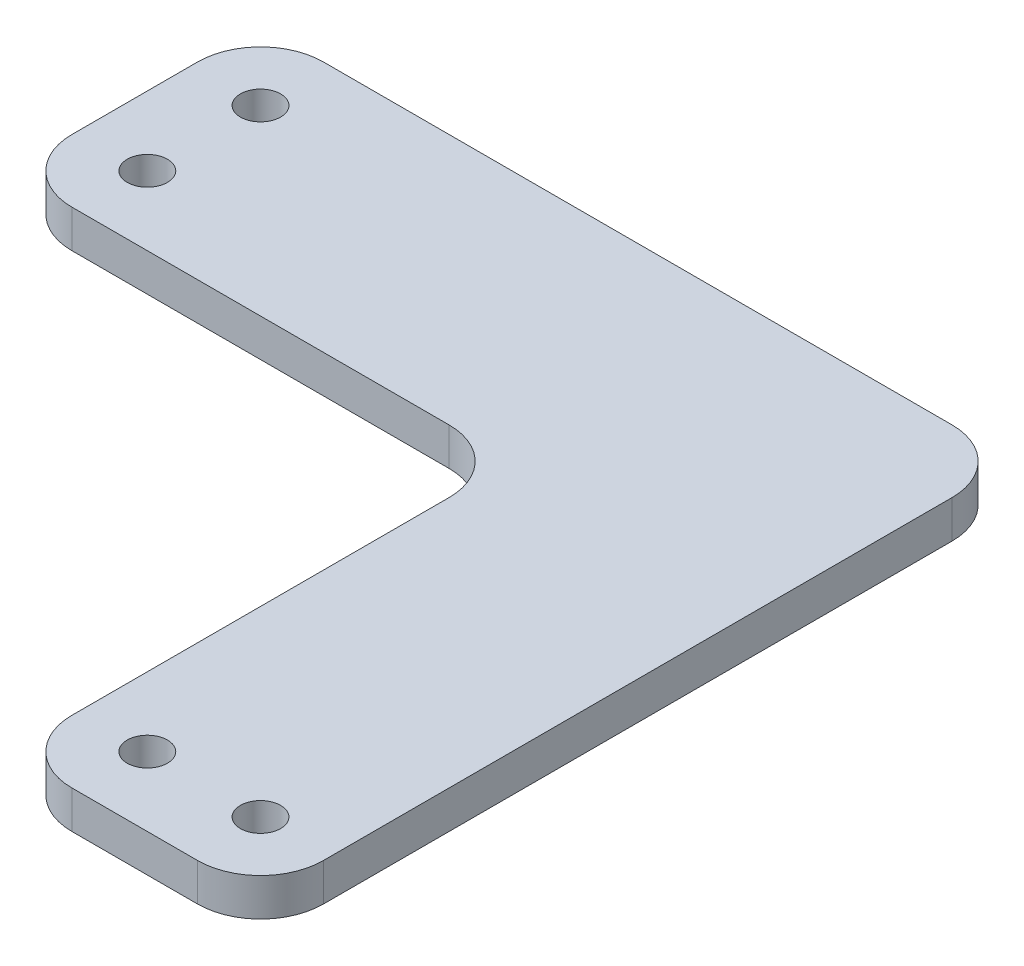
ISO-10303-21;
HEADER;
FILE_DESCRIPTION(('STEP AP214'),'2;1');
FILE_NAME('part.step','',(''),(''),'','','');
FILE_SCHEMA(('AUTOMOTIVE_DESIGN { 1 0 10303 214 1 1 1 1 }'));
ENDSEC;
DATA;
#1=APPLICATION_CONTEXT('core data for automotive mechanical design processes');
#2=APPLICATION_PROTOCOL_DEFINITION('international standard','automotive_design',2000,#1);
#3=PRODUCT_CONTEXT('',#1,'mechanical');
#4=PRODUCT('Part','Part','',(#3));
#5=PRODUCT_RELATED_PRODUCT_CATEGORY('part','',(#4));
#6=PRODUCT_DEFINITION_FORMATION('','',#4);
#7=PRODUCT_DEFINITION_CONTEXT('part definition',#1,'design');
#8=PRODUCT_DEFINITION('design','',#6,#7);
#9=PRODUCT_DEFINITION_SHAPE('','',#8);
#10=(LENGTH_UNIT() NAMED_UNIT(*) SI_UNIT(.MILLI.,.METRE.));
#11=(NAMED_UNIT(*) PLANE_ANGLE_UNIT() SI_UNIT($,.RADIAN.));
#12=(NAMED_UNIT(*) SI_UNIT($,.STERADIAN.) SOLID_ANGLE_UNIT());
#13=UNCERTAINTY_MEASURE_WITH_UNIT(LENGTH_MEASURE(1.E-05),#10,'distance_accuracy_value','');
#14=(GEOMETRIC_REPRESENTATION_CONTEXT(3) GLOBAL_UNCERTAINTY_ASSIGNED_CONTEXT((#13)) GLOBAL_UNIT_ASSIGNED_CONTEXT((#10,
#11,#12)) REPRESENTATION_CONTEXT('',''));
#15=CARTESIAN_POINT('',(0.,0.,0.));
#16=DIRECTION('',(0.,0.,1.));
#17=DIRECTION('',(1.,0.,0.));
#18=AXIS2_PLACEMENT_3D('',#15,#16,#17);
#19=CARTESIAN_POINT('',(10.,3.,20.));
#20=DIRECTION('',(-1.,0.,0.));
#21=DIRECTION('',(0.,0.,1.));
#22=AXIS2_PLACEMENT_3D('',#19,#20,#21);
#23=PLANE('',#22);
#24=DIRECTION('',(0.,0.,-1.));
#25=VECTOR('',#24,1.);
#26=CARTESIAN_POINT('',(10.,0.,20.));
#27=LINE('',#26,#25);
#28=CARTESIAN_POINT('',(10.,0.,15.));
#29=VERTEX_POINT('',#28);
#30=CARTESIAN_POINT('',(10.,0.,-35.));
#31=VERTEX_POINT('',#30);
#32=EDGE_CURVE('E153',#29,#31,#27,.T.);
#33=ORIENTED_EDGE('',*,*,#32,.T.);
#34=DIRECTION('',(0.,-1.,0.));
#35=VECTOR('',#34,1.);
#36=CARTESIAN_POINT('',(10.,3.,-35.));
#37=LINE('',#36,#35);
#38=CARTESIAN_POINT('',(10.,3.,-35.));
#39=VERTEX_POINT('',#38);
#40=EDGE_CURVE('E131',#31,#39,#37,.F.);
#41=ORIENTED_EDGE('',*,*,#40,.T.);
#42=DIRECTION('',(0.,0.,-1.));
#43=VECTOR('',#42,1.);
#44=CARTESIAN_POINT('',(10.,3.,20.));
#45=LINE('',#44,#43);
#46=CARTESIAN_POINT('',(10.,3.,15.));
#47=VERTEX_POINT('',#46);
#48=EDGE_CURVE('E169',#47,#39,#45,.T.);
#49=ORIENTED_EDGE('',*,*,#48,.F.);
#50=DIRECTION('',(0.,-1.,0.));
#51=VECTOR('',#50,1.);
#52=CARTESIAN_POINT('',(10.,3.,15.));
#53=LINE('',#52,#51);
#54=EDGE_CURVE('E136',#47,#29,#53,.T.);
#55=ORIENTED_EDGE('',*,*,#54,.T.);
#56=EDGE_LOOP('',(#33,#41,#49,#55));
#57=FACE_BOUND('',#56,.T.);
#58=ADVANCED_FACE('F36',(#57),#23,.F.);
#59=CARTESIAN_POINT('',(10.,3.,-40.));
#60=DIRECTION('',(0.,0.,1.));
#61=DIRECTION('',(1.,0.,0.));
#62=AXIS2_PLACEMENT_3D('',#59,#60,#61);
#63=PLANE('',#62);
#64=DIRECTION('',(-1.,0.,0.));
#65=VECTOR('',#64,1.);
#66=CARTESIAN_POINT('',(10.,3.,-40.));
#67=LINE('',#66,#65);
#68=CARTESIAN_POINT('',(5.,3.,-40.));
#69=VERTEX_POINT('',#68);
#70=CARTESIAN_POINT('',(-45.,3.,-40.));
#71=VERTEX_POINT('',#70);
#72=EDGE_CURVE('E146',#69,#71,#67,.T.);
#73=ORIENTED_EDGE('',*,*,#72,.F.);
#74=DIRECTION('',(0.,-1.,0.));
#75=VECTOR('',#74,1.);
#76=CARTESIAN_POINT('',(5.,3.,-40.));
#77=LINE('',#76,#75);
#78=CARTESIAN_POINT('',(5.,0.,-40.));
#79=VERTEX_POINT('',#78);
#80=EDGE_CURVE('E130',#69,#79,#77,.T.);
#81=ORIENTED_EDGE('',*,*,#80,.T.);
#82=DIRECTION('',(-1.,0.,0.));
#83=VECTOR('',#82,1.);
#84=CARTESIAN_POINT('',(10.,0.,-40.));
#85=LINE('',#84,#83);
#86=CARTESIAN_POINT('',(-45.,0.,-40.));
#87=VERTEX_POINT('',#86);
#88=EDGE_CURVE('E143',#79,#87,#85,.T.);
#89=ORIENTED_EDGE('',*,*,#88,.T.);
#90=DIRECTION('',(0.,-1.,0.));
#91=VECTOR('',#90,1.);
#92=CARTESIAN_POINT('',(-45.,3.,-40.));
#93=LINE('',#92,#91);
#94=EDGE_CURVE('E148',#87,#71,#93,.F.);
#95=ORIENTED_EDGE('',*,*,#94,.T.);
#96=EDGE_LOOP('',(#73,#81,#89,#95));
#97=FACE_BOUND('',#96,.T.);
#98=ADVANCED_FACE('F142',(#97),#63,.F.);
#99=CARTESIAN_POINT('',(-50.,3.,-40.));
#100=DIRECTION('',(1.,0.,0.));
#101=DIRECTION('',(0.,0.,-1.));
#102=AXIS2_PLACEMENT_3D('',#99,#100,#101);
#103=PLANE('',#102);
#104=DIRECTION('',(0.,0.,1.));
#105=VECTOR('',#104,1.);
#106=CARTESIAN_POINT('',(-50.,3.,-40.));
#107=LINE('',#106,#105);
#108=CARTESIAN_POINT('',(-50.,3.,-35.));
#109=VERTEX_POINT('',#108);
#110=CARTESIAN_POINT('',(-50.,3.,-25.));
#111=VERTEX_POINT('',#110);
#112=EDGE_CURVE('E229',#109,#111,#107,.T.);
#113=ORIENTED_EDGE('',*,*,#112,.F.);
#114=DIRECTION('',(0.,-1.,0.));
#115=VECTOR('',#114,1.);
#116=CARTESIAN_POINT('',(-50.,3.,-35.));
#117=LINE('',#116,#115);
#118=CARTESIAN_POINT('',(-50.,0.,-35.));
#119=VERTEX_POINT('',#118);
#120=EDGE_CURVE('E192',#109,#119,#117,.T.);
#121=ORIENTED_EDGE('',*,*,#120,.T.);
#122=DIRECTION('',(0.,0.,1.));
#123=VECTOR('',#122,1.);
#124=CARTESIAN_POINT('',(-50.,0.,-40.));
#125=LINE('',#124,#123);
#126=CARTESIAN_POINT('',(-50.,0.,-25.));
#127=VERTEX_POINT('',#126);
#128=EDGE_CURVE('E152',#119,#127,#125,.T.);
#129=ORIENTED_EDGE('',*,*,#128,.T.);
#130=DIRECTION('',(0.,-1.,0.));
#131=VECTOR('',#130,1.);
#132=CARTESIAN_POINT('',(-50.,3.,-25.));
#133=LINE('',#132,#131);
#134=EDGE_CURVE('E190',#127,#111,#133,.F.);
#135=ORIENTED_EDGE('',*,*,#134,.T.);
#136=EDGE_LOOP('',(#113,#121,#129,#135));
#137=FACE_BOUND('',#136,.T.);
#138=ADVANCED_FACE('F299',(#137),#103,.F.);
#139=CARTESIAN_POINT('',(-50.,3.,-20.));
#140=DIRECTION('',(0.,0.,-1.));
#141=DIRECTION('',(-1.,0.,0.));
#142=AXIS2_PLACEMENT_3D('',#139,#140,#141);
#143=PLANE('',#142);
#144=DIRECTION('',(1.,0.,0.));
#145=VECTOR('',#144,1.);
#146=CARTESIAN_POINT('',(-50.,0.,-20.));
#147=LINE('',#146,#145);
#148=CARTESIAN_POINT('',(-45.,0.,-20.));
#149=VERTEX_POINT('',#148);
#150=CARTESIAN_POINT('',(-15.,0.,-20.));
#151=VERTEX_POINT('',#150);
#152=EDGE_CURVE('E156',#149,#151,#147,.T.);
#153=ORIENTED_EDGE('',*,*,#152,.T.);
#154=DIRECTION('',(0.,-1.,0.));
#155=VECTOR('',#154,1.);
#156=CARTESIAN_POINT('',(-15.,3.,-20.));
#157=LINE('',#156,#155);
#158=CARTESIAN_POINT('',(-15.,3.,-20.));
#159=VERTEX_POINT('',#158);
#160=EDGE_CURVE('E207',#151,#159,#157,.F.);
#161=ORIENTED_EDGE('',*,*,#160,.T.);
#162=DIRECTION('',(1.,0.,0.));
#163=VECTOR('',#162,1.);
#164=CARTESIAN_POINT('',(-50.,3.,-20.));
#165=LINE('',#164,#163);
#166=CARTESIAN_POINT('',(-45.,3.,-20.));
#167=VERTEX_POINT('',#166);
#168=EDGE_CURVE('E224',#167,#159,#165,.T.);
#169=ORIENTED_EDGE('',*,*,#168,.F.);
#170=DIRECTION('',(0.,-1.,0.));
#171=VECTOR('',#170,1.);
#172=CARTESIAN_POINT('',(-45.,3.,-20.));
#173=LINE('',#172,#171);
#174=EDGE_CURVE('E204',#167,#149,#173,.T.);
#175=ORIENTED_EDGE('',*,*,#174,.T.);
#176=EDGE_LOOP('',(#153,#161,#169,#175));
#177=FACE_BOUND('',#176,.T.);
#178=ADVANCED_FACE('F214',(#177),#143,.F.);
#179=CARTESIAN_POINT('',(-10.,3.,-20.));
#180=DIRECTION('',(1.,0.,0.));
#181=DIRECTION('',(0.,0.,-1.));
#182=AXIS2_PLACEMENT_3D('',#179,#180,#181);
#183=PLANE('',#182);
#184=DIRECTION('',(0.,0.,1.));
#185=VECTOR('',#184,1.);
#186=CARTESIAN_POINT('',(-10.,0.,-20.));
#187=LINE('',#186,#185);
#188=CARTESIAN_POINT('',(-10.,0.,-15.));
#189=VERTEX_POINT('',#188);
#190=CARTESIAN_POINT('',(-10.,0.,15.));
#191=VERTEX_POINT('',#190);
#192=EDGE_CURVE('E164',#189,#191,#187,.T.);
#193=ORIENTED_EDGE('',*,*,#192,.T.);
#194=DIRECTION('',(0.,-1.,0.));
#195=VECTOR('',#194,1.);
#196=CARTESIAN_POINT('',(-10.,3.,15.));
#197=LINE('',#196,#195);
#198=CARTESIAN_POINT('',(-10.,3.,15.));
#199=VERTEX_POINT('',#198);
#200=EDGE_CURVE('E202',#191,#199,#197,.F.);
#201=ORIENTED_EDGE('',*,*,#200,.T.);
#202=DIRECTION('',(0.,0.,1.));
#203=VECTOR('',#202,1.);
#204=CARTESIAN_POINT('',(-10.,3.,-20.));
#205=LINE('',#204,#203);
#206=CARTESIAN_POINT('',(-10.,3.,-15.));
#207=VERTEX_POINT('',#206);
#208=EDGE_CURVE('E223',#207,#199,#205,.T.);
#209=ORIENTED_EDGE('',*,*,#208,.F.);
#210=DIRECTION('',(0.,-1.,0.));
#211=VECTOR('',#210,1.);
#212=CARTESIAN_POINT('',(-10.,0.,-15.));
#213=LINE('',#212,#211);
#214=EDGE_CURVE('E199',#207,#189,#213,.T.);
#215=ORIENTED_EDGE('',*,*,#214,.T.);
#216=EDGE_LOOP('',(#193,#201,#209,#215));
#217=FACE_BOUND('',#216,.T.);
#218=ADVANCED_FACE('F226',(#217),#183,.F.);
#219=CARTESIAN_POINT('',(-10.,3.,20.));
#220=DIRECTION('',(0.,0.,-1.));
#221=DIRECTION('',(-1.,0.,0.));
#222=AXIS2_PLACEMENT_3D('',#219,#220,#221);
#223=PLANE('',#222);
#224=DIRECTION('',(1.,0.,0.));
#225=VECTOR('',#224,1.);
#226=CARTESIAN_POINT('',(-10.,0.,20.));
#227=LINE('',#226,#225);
#228=CARTESIAN_POINT('',(-5.,0.,20.));
#229=VERTEX_POINT('',#228);
#230=CARTESIAN_POINT('',(5.,0.,20.));
#231=VERTEX_POINT('',#230);
#232=EDGE_CURVE('E167',#229,#231,#227,.T.);
#233=ORIENTED_EDGE('',*,*,#232,.T.);
#234=DIRECTION('',(0.,-1.,0.));
#235=VECTOR('',#234,1.);
#236=CARTESIAN_POINT('',(5.,3.,20.));
#237=LINE('',#236,#235);
#238=CARTESIAN_POINT('',(5.,3.,20.));
#239=VERTEX_POINT('',#238);
#240=EDGE_CURVE('E51',#231,#239,#237,.F.);
#241=ORIENTED_EDGE('',*,*,#240,.T.);
#242=DIRECTION('',(1.,0.,0.));
#243=VECTOR('',#242,1.);
#244=CARTESIAN_POINT('',(-10.,3.,20.));
#245=LINE('',#244,#243);
#246=CARTESIAN_POINT('',(-5.,3.,20.));
#247=VERTEX_POINT('',#246);
#248=EDGE_CURVE('E170',#247,#239,#245,.T.);
#249=ORIENTED_EDGE('',*,*,#248,.F.);
#250=DIRECTION('',(0.,-1.,0.));
#251=VECTOR('',#250,1.);
#252=CARTESIAN_POINT('',(-5.,3.,20.));
#253=LINE('',#252,#251);
#254=EDGE_CURVE('E195',#247,#229,#253,.T.);
#255=ORIENTED_EDGE('',*,*,#254,.T.);
#256=EDGE_LOOP('',(#233,#241,#249,#255));
#257=FACE_BOUND('',#256,.T.);
#258=ADVANCED_FACE('F271',(#257),#223,.F.);
#259=CARTESIAN_POINT('',(0.,3.,0.));
#260=DIRECTION('',(0.,1.,0.));
#261=DIRECTION('',(0.,0.,1.));
#262=AXIS2_PLACEMENT_3D('',#259,#260,#261);
#263=PLANE('',#262);
#264=CARTESIAN_POINT('',(-44.5,3.,-34.5));
#265=DIRECTION('',(0.,1.,0.));
#266=DIRECTION('',(0.,0.,1.));
#267=AXIS2_PLACEMENT_3D('',#264,#265,#266);
#268=CIRCLE('',#267,1.6);
#269=CARTESIAN_POINT('',(-44.5,3.,-32.9));
#270=VERTEX_POINT('',#269);
#271=EDGE_CURVE('E249',#270,#270,#268,.T.);
#272=ORIENTED_EDGE('',*,*,#271,.F.);
#273=EDGE_LOOP('',(#272));
#274=FACE_BOUND('',#273,.T.);
#275=CARTESIAN_POINT('',(-4.5,3.,14.5));
#276=DIRECTION('',(0.,1.,0.));
#277=DIRECTION('',(0.,0.,1.));
#278=AXIS2_PLACEMENT_3D('',#275,#276,#277);
#279=CIRCLE('',#278,1.6);
#280=CARTESIAN_POINT('',(-4.5,3.,16.1));
#281=VERTEX_POINT('',#280);
#282=EDGE_CURVE('E250',#281,#281,#279,.T.);
#283=ORIENTED_EDGE('',*,*,#282,.F.);
#284=EDGE_LOOP('',(#283));
#285=FACE_BOUND('',#284,.T.);
#286=CARTESIAN_POINT('',(4.5,3.,14.5));
#287=DIRECTION('',(0.,1.,0.));
#288=DIRECTION('',(0.,0.,1.));
#289=AXIS2_PLACEMENT_3D('',#286,#287,#288);
#290=CIRCLE('',#289,1.6);
#291=CARTESIAN_POINT('',(4.5,3.,16.1));
#292=VERTEX_POINT('',#291);
#293=EDGE_CURVE('E236',#292,#292,#290,.T.);
#294=ORIENTED_EDGE('',*,*,#293,.F.);
#295=EDGE_LOOP('',(#294));
#296=FACE_BOUND('',#295,.T.);
#297=CARTESIAN_POINT('',(-44.5,3.,-25.5));
#298=DIRECTION('',(0.,1.,0.));
#299=DIRECTION('',(0.,0.,1.));
#300=AXIS2_PLACEMENT_3D('',#297,#298,#299);
#301=CIRCLE('',#300,1.6);
#302=CARTESIAN_POINT('',(-44.5,3.,-23.9));
#303=VERTEX_POINT('',#302);
#304=EDGE_CURVE('E243',#303,#303,#301,.T.);
#305=ORIENTED_EDGE('',*,*,#304,.F.);
#306=EDGE_LOOP('',(#305));
#307=FACE_BOUND('',#306,.T.);
#308=ORIENTED_EDGE('',*,*,#48,.T.);
#309=CARTESIAN_POINT('',(5.,3.,-35.));
#310=DIRECTION('',(0.,1.,0.));
#311=DIRECTION('',(0.,0.,1.));
#312=AXIS2_PLACEMENT_3D('',#309,#310,#311);
#313=CIRCLE('',#312,5.);
#314=EDGE_CURVE('E188',#39,#69,#313,.T.);
#315=ORIENTED_EDGE('',*,*,#314,.T.);
#316=ORIENTED_EDGE('',*,*,#72,.T.);
#317=CARTESIAN_POINT('',(-45.,3.,-35.));
#318=DIRECTION('',(0.,1.,0.));
#319=DIRECTION('',(0.,0.,1.));
#320=AXIS2_PLACEMENT_3D('',#317,#318,#319);
#321=CIRCLE('',#320,5.);
#322=EDGE_CURVE('E186',#71,#109,#321,.T.);
#323=ORIENTED_EDGE('',*,*,#322,.T.);
#324=ORIENTED_EDGE('',*,*,#112,.T.);
#325=CARTESIAN_POINT('',(-45.,3.,-25.));
#326=DIRECTION('',(0.,1.,0.));
#327=DIRECTION('',(0.,0.,1.));
#328=AXIS2_PLACEMENT_3D('',#325,#326,#327);
#329=CIRCLE('',#328,5.);
#330=EDGE_CURVE('E181',#111,#167,#329,.T.);
#331=ORIENTED_EDGE('',*,*,#330,.T.);
#332=ORIENTED_EDGE('',*,*,#168,.T.);
#333=CARTESIAN_POINT('',(-15.,3.,-15.));
#334=DIRECTION('',(0.,1.,0.));
#335=DIRECTION('',(0.,0.,1.));
#336=AXIS2_PLACEMENT_3D('',#333,#334,#335);
#337=CIRCLE('',#336,5.);
#338=EDGE_CURVE('E11',#159,#207,#337,.F.);
#339=ORIENTED_EDGE('',*,*,#338,.T.);
#340=ORIENTED_EDGE('',*,*,#208,.T.);
#341=CARTESIAN_POINT('',(-5.,3.,15.));
#342=DIRECTION('',(0.,1.,0.));
#343=DIRECTION('',(0.,0.,1.));
#344=AXIS2_PLACEMENT_3D('',#341,#342,#343);
#345=CIRCLE('',#344,5.);
#346=EDGE_CURVE('E58',#199,#247,#345,.T.);
#347=ORIENTED_EDGE('',*,*,#346,.T.);
#348=ORIENTED_EDGE('',*,*,#248,.T.);
#349=CARTESIAN_POINT('',(5.,3.,15.));
#350=DIRECTION('',(0.,1.,0.));
#351=DIRECTION('',(0.,0.,1.));
#352=AXIS2_PLACEMENT_3D('',#349,#350,#351);
#353=CIRCLE('',#352,5.);
#354=EDGE_CURVE('E184',#239,#47,#353,.T.);
#355=ORIENTED_EDGE('',*,*,#354,.T.);
#356=EDGE_LOOP('',(#308,#315,#316,#323,#324,#331,#332,#339,#340,#347,#348,#355));
#357=FACE_BOUND('',#356,.T.);
#358=ADVANCED_FACE('F222',(#274,#285,#296,#307,#357),#263,.T.);
#359=CARTESIAN_POINT('',(0.,0.,0.));
#360=DIRECTION('',(0.,1.,0.));
#361=DIRECTION('',(0.,0.,1.));
#362=AXIS2_PLACEMENT_3D('',#359,#360,#361);
#363=PLANE('',#362);
#364=CARTESIAN_POINT('',(-44.5,0.,-34.5));
#365=DIRECTION('',(0.,1.,0.));
#366=DIRECTION('',(0.,0.,1.));
#367=AXIS2_PLACEMENT_3D('',#364,#365,#366);
#368=CIRCLE('',#367,1.6);
#369=CARTESIAN_POINT('',(-44.5,0.,-32.9));
#370=VERTEX_POINT('',#369);
#371=EDGE_CURVE('E158',#370,#370,#368,.T.);
#372=ORIENTED_EDGE('',*,*,#371,.T.);
#373=EDGE_LOOP('',(#372));
#374=FACE_BOUND('',#373,.T.);
#375=CARTESIAN_POINT('',(-4.5,0.,14.5));
#376=DIRECTION('',(0.,1.,0.));
#377=DIRECTION('',(0.,0.,1.));
#378=AXIS2_PLACEMENT_3D('',#375,#376,#377);
#379=CIRCLE('',#378,1.6);
#380=CARTESIAN_POINT('',(-4.5,0.,16.1));
#381=VERTEX_POINT('',#380);
#382=EDGE_CURVE('E240',#381,#381,#379,.T.);
#383=ORIENTED_EDGE('',*,*,#382,.T.);
#384=EDGE_LOOP('',(#383));
#385=FACE_BOUND('',#384,.T.);
#386=CARTESIAN_POINT('',(4.5,0.,14.5));
#387=DIRECTION('',(0.,1.,0.));
#388=DIRECTION('',(0.,0.,1.));
#389=AXIS2_PLACEMENT_3D('',#386,#387,#388);
#390=CIRCLE('',#389,1.6);
#391=CARTESIAN_POINT('',(4.5,0.,16.1));
#392=VERTEX_POINT('',#391);
#393=EDGE_CURVE('E239',#392,#392,#390,.T.);
#394=ORIENTED_EDGE('',*,*,#393,.T.);
#395=EDGE_LOOP('',(#394));
#396=FACE_BOUND('',#395,.T.);
#397=CARTESIAN_POINT('',(-44.5,0.,-25.5));
#398=DIRECTION('',(0.,1.,0.));
#399=DIRECTION('',(0.,0.,1.));
#400=AXIS2_PLACEMENT_3D('',#397,#398,#399);
#401=CIRCLE('',#400,1.6);
#402=CARTESIAN_POINT('',(-44.5,0.,-23.9));
#403=VERTEX_POINT('',#402);
#404=EDGE_CURVE('E246',#403,#403,#401,.T.);
#405=ORIENTED_EDGE('',*,*,#404,.T.);
#406=EDGE_LOOP('',(#405));
#407=FACE_BOUND('',#406,.T.);
#408=ORIENTED_EDGE('',*,*,#88,.F.);
#409=CARTESIAN_POINT('',(5.,0.,-35.));
#410=DIRECTION('',(0.,1.,0.));
#411=DIRECTION('',(0.,0.,1.));
#412=AXIS2_PLACEMENT_3D('',#409,#410,#411);
#413=CIRCLE('',#412,5.);
#414=EDGE_CURVE('E126',#79,#31,#413,.F.);
#415=ORIENTED_EDGE('',*,*,#414,.T.);
#416=ORIENTED_EDGE('',*,*,#32,.F.);
#417=CARTESIAN_POINT('',(5.,0.,15.));
#418=DIRECTION('',(0.,1.,0.));
#419=DIRECTION('',(0.,0.,1.));
#420=AXIS2_PLACEMENT_3D('',#417,#418,#419);
#421=CIRCLE('',#420,5.);
#422=EDGE_CURVE('E175',#29,#231,#421,.F.);
#423=ORIENTED_EDGE('',*,*,#422,.T.);
#424=ORIENTED_EDGE('',*,*,#232,.F.);
#425=CARTESIAN_POINT('',(-5.,0.,15.));
#426=DIRECTION('',(0.,1.,0.));
#427=DIRECTION('',(0.,0.,1.));
#428=AXIS2_PLACEMENT_3D('',#425,#426,#427);
#429=CIRCLE('',#428,5.);
#430=EDGE_CURVE('E173',#229,#191,#429,.F.);
#431=ORIENTED_EDGE('',*,*,#430,.T.);
#432=ORIENTED_EDGE('',*,*,#192,.F.);
#433=CARTESIAN_POINT('',(-15.,0.,-15.));
#434=DIRECTION('',(0.,1.,0.));
#435=DIRECTION('',(0.,0.,1.));
#436=AXIS2_PLACEMENT_3D('',#433,#434,#435);
#437=CIRCLE('',#436,5.);
#438=EDGE_CURVE('E44',#189,#151,#437,.T.);
#439=ORIENTED_EDGE('',*,*,#438,.T.);
#440=ORIENTED_EDGE('',*,*,#152,.F.);
#441=CARTESIAN_POINT('',(-45.,0.,-25.));
#442=DIRECTION('',(0.,1.,0.));
#443=DIRECTION('',(0.,0.,1.));
#444=AXIS2_PLACEMENT_3D('',#441,#442,#443);
#445=CIRCLE('',#444,5.);
#446=EDGE_CURVE('E147',#149,#127,#445,.F.);
#447=ORIENTED_EDGE('',*,*,#446,.T.);
#448=ORIENTED_EDGE('',*,*,#128,.F.);
#449=CARTESIAN_POINT('',(-45.,0.,-35.));
#450=DIRECTION('',(0.,1.,0.));
#451=DIRECTION('',(0.,0.,1.));
#452=AXIS2_PLACEMENT_3D('',#449,#450,#451);
#453=CIRCLE('',#452,5.);
#454=EDGE_CURVE('E137',#119,#87,#453,.F.);
#455=ORIENTED_EDGE('',*,*,#454,.T.);
#456=EDGE_LOOP('',(#408,#415,#416,#423,#424,#431,#432,#439,#440,#447,#448,#455));
#457=FACE_BOUND('',#456,.T.);
#458=ADVANCED_FACE('F150',(#374,#385,#396,#407,#457),#363,.F.);
#459=CARTESIAN_POINT('',(-44.5,0.,-25.5));
#460=DIRECTION('',(0.,1.,0.));
#461=DIRECTION('',(0.,0.,1.));
#462=AXIS2_PLACEMENT_3D('',#459,#460,#461);
#463=CYLINDRICAL_SURFACE('',#462,1.6);
#464=ORIENTED_EDGE('',*,*,#404,.F.);
#465=EDGE_LOOP('',(#464));
#466=FACE_BOUND('',#465,.T.);
#467=ORIENTED_EDGE('',*,*,#304,.T.);
#468=EDGE_LOOP('',(#467));
#469=FACE_BOUND('',#468,.T.);
#470=ADVANCED_FACE('F279',(#466,#469),#463,.F.);
#471=CARTESIAN_POINT('',(4.5,0.,14.5));
#472=DIRECTION('',(0.,1.,0.));
#473=DIRECTION('',(0.,0.,1.));
#474=AXIS2_PLACEMENT_3D('',#471,#472,#473);
#475=CYLINDRICAL_SURFACE('',#474,1.6);
#476=ORIENTED_EDGE('',*,*,#393,.F.);
#477=EDGE_LOOP('',(#476));
#478=FACE_BOUND('',#477,.T.);
#479=ORIENTED_EDGE('',*,*,#293,.T.);
#480=EDGE_LOOP('',(#479));
#481=FACE_BOUND('',#480,.T.);
#482=ADVANCED_FACE('F281',(#478,#481),#475,.F.);
#483=CARTESIAN_POINT('',(-4.5,0.,14.5));
#484=DIRECTION('',(0.,1.,0.));
#485=DIRECTION('',(0.,0.,1.));
#486=AXIS2_PLACEMENT_3D('',#483,#484,#485);
#487=CYLINDRICAL_SURFACE('',#486,1.6);
#488=ORIENTED_EDGE('',*,*,#382,.F.);
#489=EDGE_LOOP('',(#488));
#490=FACE_BOUND('',#489,.T.);
#491=ORIENTED_EDGE('',*,*,#282,.T.);
#492=EDGE_LOOP('',(#491));
#493=FACE_BOUND('',#492,.T.);
#494=ADVANCED_FACE('F265',(#490,#493),#487,.F.);
#495=CARTESIAN_POINT('',(-44.5,0.,-34.5));
#496=DIRECTION('',(0.,1.,0.));
#497=DIRECTION('',(0.,0.,1.));
#498=AXIS2_PLACEMENT_3D('',#495,#496,#497);
#499=CYLINDRICAL_SURFACE('',#498,1.6);
#500=ORIENTED_EDGE('',*,*,#371,.F.);
#501=EDGE_LOOP('',(#500));
#502=FACE_BOUND('',#501,.T.);
#503=ORIENTED_EDGE('',*,*,#271,.T.);
#504=EDGE_LOOP('',(#503));
#505=FACE_BOUND('',#504,.T.);
#506=ADVANCED_FACE('F262',(#502,#505),#499,.F.);
#507=CARTESIAN_POINT('',(5.,3.,-35.));
#508=DIRECTION('',(0.,-1.,0.));
#509=DIRECTION('',(0.,0.,-1.));
#510=AXIS2_PLACEMENT_3D('',#507,#508,#509);
#511=CYLINDRICAL_SURFACE('',#510,5.);
#512=ORIENTED_EDGE('',*,*,#314,.F.);
#513=ORIENTED_EDGE('',*,*,#40,.F.);
#514=ORIENTED_EDGE('',*,*,#414,.F.);
#515=ORIENTED_EDGE('',*,*,#80,.F.);
#516=EDGE_LOOP('',(#512,#513,#514,#515));
#517=FACE_BOUND('',#516,.T.);
#518=ADVANCED_FACE('F129',(#517),#511,.T.);
#519=CARTESIAN_POINT('',(-45.,3.,-35.));
#520=DIRECTION('',(0.,-1.,0.));
#521=DIRECTION('',(0.,0.,-1.));
#522=AXIS2_PLACEMENT_3D('',#519,#520,#521);
#523=CYLINDRICAL_SURFACE('',#522,5.);
#524=ORIENTED_EDGE('',*,*,#322,.F.);
#525=ORIENTED_EDGE('',*,*,#94,.F.);
#526=ORIENTED_EDGE('',*,*,#454,.F.);
#527=ORIENTED_EDGE('',*,*,#120,.F.);
#528=EDGE_LOOP('',(#524,#525,#526,#527));
#529=FACE_BOUND('',#528,.T.);
#530=ADVANCED_FACE('F305',(#529),#523,.T.);
#531=CARTESIAN_POINT('',(5.,3.,15.));
#532=DIRECTION('',(0.,-1.,0.));
#533=DIRECTION('',(0.,0.,-1.));
#534=AXIS2_PLACEMENT_3D('',#531,#532,#533);
#535=CYLINDRICAL_SURFACE('',#534,5.);
#536=ORIENTED_EDGE('',*,*,#354,.F.);
#537=ORIENTED_EDGE('',*,*,#240,.F.);
#538=ORIENTED_EDGE('',*,*,#422,.F.);
#539=ORIENTED_EDGE('',*,*,#54,.F.);
#540=EDGE_LOOP('',(#536,#537,#538,#539));
#541=FACE_BOUND('',#540,.T.);
#542=ADVANCED_FACE('F308',(#541),#535,.T.);
#543=CARTESIAN_POINT('',(-5.,3.,15.));
#544=DIRECTION('',(0.,-1.,0.));
#545=DIRECTION('',(0.,0.,-1.));
#546=AXIS2_PLACEMENT_3D('',#543,#544,#545);
#547=CYLINDRICAL_SURFACE('',#546,5.);
#548=ORIENTED_EDGE('',*,*,#346,.F.);
#549=ORIENTED_EDGE('',*,*,#200,.F.);
#550=ORIENTED_EDGE('',*,*,#430,.F.);
#551=ORIENTED_EDGE('',*,*,#254,.F.);
#552=EDGE_LOOP('',(#548,#549,#550,#551));
#553=FACE_BOUND('',#552,.T.);
#554=ADVANCED_FACE('F312',(#553),#547,.T.);
#555=CARTESIAN_POINT('',(-15.,3.,-15.));
#556=DIRECTION('',(0.,1.,0.));
#557=DIRECTION('',(0.,0.,1.));
#558=AXIS2_PLACEMENT_3D('',#555,#556,#557);
#559=CYLINDRICAL_SURFACE('',#558,5.);
#560=ORIENTED_EDGE('',*,*,#338,.F.);
#561=ORIENTED_EDGE('',*,*,#160,.F.);
#562=ORIENTED_EDGE('',*,*,#438,.F.);
#563=ORIENTED_EDGE('',*,*,#214,.F.);
#564=EDGE_LOOP('',(#560,#561,#562,#563));
#565=FACE_BOUND('',#564,.T.);
#566=ADVANCED_FACE('F219',(#565),#559,.F.);
#567=CARTESIAN_POINT('',(-45.,3.,-25.));
#568=DIRECTION('',(0.,-1.,0.));
#569=DIRECTION('',(0.,0.,-1.));
#570=AXIS2_PLACEMENT_3D('',#567,#568,#569);
#571=CYLINDRICAL_SURFACE('',#570,5.);
#572=ORIENTED_EDGE('',*,*,#330,.F.);
#573=ORIENTED_EDGE('',*,*,#134,.F.);
#574=ORIENTED_EDGE('',*,*,#446,.F.);
#575=ORIENTED_EDGE('',*,*,#174,.F.);
#576=EDGE_LOOP('',(#572,#573,#574,#575));
#577=FACE_BOUND('',#576,.T.);
#578=ADVANCED_FACE('F38',(#577),#571,.T.);
#579=CLOSED_SHELL('',(#58,#98,#138,#178,#218,#258,#358,#458,#470,#482,#494,#506,#518,#530,#542,
#554,#566,#578));
#580=MANIFOLD_SOLID_BREP('B2',#579);
#581=ADVANCED_BREP_SHAPE_REPRESENTATION('',(#18,#580),#14);
#582=SHAPE_DEFINITION_REPRESENTATION(#9,#581);
ENDSEC;
END-ISO-10303-21;
